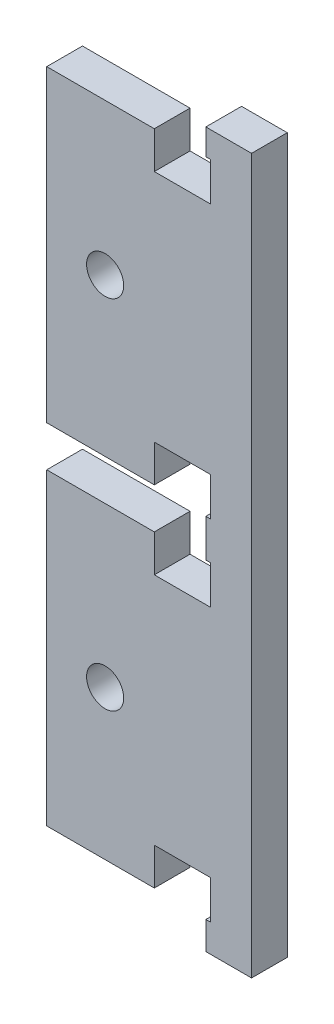
ISO-10303-21;
HEADER;
FILE_DESCRIPTION(('STEP AP214'),'2;1');
FILE_NAME('part.step','',(''),(''),'','','');
FILE_SCHEMA(('AUTOMOTIVE_DESIGN { 1 0 10303 214 1 1 1 1 }'));
ENDSEC;
DATA;
#1=APPLICATION_CONTEXT('core data for automotive mechanical design processes');
#2=APPLICATION_PROTOCOL_DEFINITION('international standard','automotive_design',2000,#1);
#3=PRODUCT_CONTEXT('',#1,'mechanical');
#4=PRODUCT('Part','Part','',(#3));
#5=PRODUCT_RELATED_PRODUCT_CATEGORY('part','',(#4));
#6=PRODUCT_DEFINITION_FORMATION('','',#4);
#7=PRODUCT_DEFINITION_CONTEXT('part definition',#1,'design');
#8=PRODUCT_DEFINITION('design','',#6,#7);
#9=PRODUCT_DEFINITION_SHAPE('','',#8);
#10=(LENGTH_UNIT() NAMED_UNIT(*) SI_UNIT(.MILLI.,.METRE.));
#11=(NAMED_UNIT(*) PLANE_ANGLE_UNIT() SI_UNIT($,.RADIAN.));
#12=(NAMED_UNIT(*) SI_UNIT($,.STERADIAN.) SOLID_ANGLE_UNIT());
#13=UNCERTAINTY_MEASURE_WITH_UNIT(LENGTH_MEASURE(1.E-05),#10,'distance_accuracy_value','');
#14=(GEOMETRIC_REPRESENTATION_CONTEXT(3) GLOBAL_UNCERTAINTY_ASSIGNED_CONTEXT((#13)) GLOBAL_UNIT_ASSIGNED_CONTEXT((#10,
#11,#12)) REPRESENTATION_CONTEXT('',''));
#15=CARTESIAN_POINT('',(0.,0.,0.));
#16=DIRECTION('',(0.,0.,1.));
#17=DIRECTION('',(1.,0.,0.));
#18=AXIS2_PLACEMENT_3D('',#15,#16,#17);
#19=CARTESIAN_POINT('',(0.,0.,6.35));
#20=DIRECTION('',(0.,0.,-1.));
#21=DIRECTION('',(-1.,0.,0.));
#22=AXIS2_PLACEMENT_3D('',#19,#20,#21);
#23=PLANE('',#22);
#24=CARTESIAN_POINT('',(-332.325441570954,231.035658294021,6.35));
#25=DIRECTION('',(0.,0.,1.));
#26=DIRECTION('',(1.,0.,0.));
#27=AXIS2_PLACEMENT_3D('',#24,#25,#26);
#28=CIRCLE('',#27,3.30000000000003);
#29=CARTESIAN_POINT('',(-329.025441570954,231.035658294021,6.35));
#30=VERTEX_POINT('',#29);
#31=EDGE_CURVE('E522',#30,#30,#28,.T.);
#32=ORIENTED_EDGE('',*,*,#31,.F.);
#33=EDGE_LOOP('',(#32));
#34=FACE_BOUND('',#33,.T.);
#35=CARTESIAN_POINT('',(-332.325441570954,167.535658294021,6.35));
#36=DIRECTION('',(0.,0.,1.));
#37=DIRECTION('',(1.,0.,0.));
#38=AXIS2_PLACEMENT_3D('',#35,#36,#37);
#39=CIRCLE('',#38,3.30000000000003);
#40=CARTESIAN_POINT('',(-329.025441570954,167.535658294021,6.35));
#41=VERTEX_POINT('',#40);
#42=EDGE_CURVE('E516',#41,#41,#39,.T.);
#43=ORIENTED_EDGE('',*,*,#42,.F.);
#44=EDGE_LOOP('',(#43));
#45=FACE_BOUND('',#44,.T.);
#46=DIRECTION('',(0.,1.,0.));
#47=VECTOR('',#46,1.);
#48=CARTESIAN_POINT('',(-306.290441570954,135.785658294024,6.35));
#49=LINE('',#48,#47);
#50=CARTESIAN_POINT('',(-306.290441570954,135.785658294024,6.35));
#51=VERTEX_POINT('',#50);
#52=CARTESIAN_POINT('',(-306.290441570954,262.785658294021,6.35));
#53=VERTEX_POINT('',#52);
#54=EDGE_CURVE('E506',#51,#53,#49,.T.);
#55=ORIENTED_EDGE('',*,*,#54,.T.);
#56=DIRECTION('',(-1.,0.,0.));
#57=VECTOR('',#56,1.);
#58=CARTESIAN_POINT('',(0.,262.785658294021,6.35));
#59=LINE('',#58,#57);
#60=CARTESIAN_POINT('',(-314.418441570953,262.785658294021,6.35));
#61=VERTEX_POINT('',#60);
#62=EDGE_CURVE('E482',#53,#61,#59,.T.);
#63=ORIENTED_EDGE('',*,*,#62,.T.);
#64=DIRECTION('',(0.,1.,0.));
#65=VECTOR('',#64,1.);
#66=CARTESIAN_POINT('',(-314.418441570953,0.,6.35));
#67=LINE('',#66,#65);
#68=CARTESIAN_POINT('',(-314.418441570953,258.188258294025,6.35));
#69=VERTEX_POINT('',#68);
#70=EDGE_CURVE('E537',#69,#61,#67,.T.);
#71=ORIENTED_EDGE('',*,*,#70,.F.);
#72=DIRECTION('',(-1.,0.,0.));
#73=VECTOR('',#72,1.);
#74=CARTESIAN_POINT('',(0.,258.188258294025,6.35));
#75=LINE('',#74,#73);
#76=CARTESIAN_POINT('',(-313.54847180827,258.188258294025,6.35));
#77=VERTEX_POINT('',#76);
#78=EDGE_CURVE('E596',#77,#69,#75,.T.);
#79=ORIENTED_EDGE('',*,*,#78,.F.);
#80=DIRECTION('',(0.,1.,0.));
#81=VECTOR('',#80,1.);
#82=CARTESIAN_POINT('',(-313.54847180827,0.,6.35));
#83=LINE('',#82,#81);
#84=CARTESIAN_POINT('',(-313.54847180827,251.330258294025,6.35));
#85=VERTEX_POINT('',#84);
#86=EDGE_CURVE('E598',#85,#77,#83,.T.);
#87=ORIENTED_EDGE('',*,*,#86,.F.);
#88=DIRECTION('',(1.,0.,0.));
#89=VECTOR('',#88,1.);
#90=CARTESIAN_POINT('',(0.,251.330258294025,6.35));
#91=LINE('',#90,#89);
#92=CARTESIAN_POINT('',(-323.58147180827,251.330258294025,6.35));
#93=VERTEX_POINT('',#92);
#94=EDGE_CURVE('E601',#93,#85,#91,.T.);
#95=ORIENTED_EDGE('',*,*,#94,.F.);
#96=DIRECTION('',(0.,1.,0.));
#97=VECTOR('',#96,1.);
#98=CARTESIAN_POINT('',(-323.58147180827,0.,6.35));
#99=LINE('',#98,#97);
#100=CARTESIAN_POINT('',(-323.58147180827,257.927658294024,6.35));
#101=VERTEX_POINT('',#100);
#102=EDGE_CURVE('E604',#93,#101,#99,.T.);
#103=ORIENTED_EDGE('',*,*,#102,.T.);
#104=DIRECTION('',(1.,0.,0.));
#105=VECTOR('',#104,1.);
#106=CARTESIAN_POINT('',(0.,257.927658294024,6.35));
#107=LINE('',#106,#105);
#108=CARTESIAN_POINT('',(-342.708441632954,257.927658294024,6.35));
#109=VERTEX_POINT('',#108);
#110=EDGE_CURVE('E541',#109,#101,#107,.T.);
#111=ORIENTED_EDGE('',*,*,#110,.F.);
#112=DIRECTION('',(0.,-1.,0.));
#113=VECTOR('',#112,1.);
#114=CARTESIAN_POINT('',(-342.708441632954,1.09887595543316E-12,6.35));
#115=LINE('',#114,#113);
#116=CARTESIAN_POINT('',(-342.708441632954,203.079658294025,6.35));
#117=VERTEX_POINT('',#116);
#118=EDGE_CURVE('E544',#109,#117,#115,.T.);
#119=ORIENTED_EDGE('',*,*,#118,.T.);
#120=DIRECTION('',(-1.,0.,0.));
#121=VECTOR('',#120,1.);
#122=CARTESIAN_POINT('',(0.,203.079658294025,6.35));
#123=LINE('',#122,#121);
#124=CARTESIAN_POINT('',(-323.58147180827,203.079658294025,6.35));
#125=VERTEX_POINT('',#124);
#126=EDGE_CURVE('E547',#125,#117,#123,.T.);
#127=ORIENTED_EDGE('',*,*,#126,.F.);
#128=DIRECTION('',(0.,1.,0.));
#129=VECTOR('',#128,1.);
#130=CARTESIAN_POINT('',(-323.58147180827,0.,6.35));
#131=LINE('',#130,#129);
#132=CARTESIAN_POINT('',(-323.58147180827,209.674258294025,6.35));
#133=VERTEX_POINT('',#132);
#134=EDGE_CURVE('E628',#125,#133,#131,.T.);
#135=ORIENTED_EDGE('',*,*,#134,.T.);
#136=DIRECTION('',(-1.,0.,0.));
#137=VECTOR('',#136,1.);
#138=CARTESIAN_POINT('',(0.,209.674258294025,6.35));
#139=LINE('',#138,#137);
#140=CARTESIAN_POINT('',(-313.54847180827,209.674258294025,6.35));
#141=VERTEX_POINT('',#140);
#142=EDGE_CURVE('E632',#141,#133,#139,.T.);
#143=ORIENTED_EDGE('',*,*,#142,.F.);
#144=DIRECTION('',(0.,1.,0.));
#145=VECTOR('',#144,1.);
#146=CARTESIAN_POINT('',(-313.54847180827,0.,6.35));
#147=LINE('',#146,#145);
#148=CARTESIAN_POINT('',(-313.54847180827,202.816258294025,6.35));
#149=VERTEX_POINT('',#148);
#150=EDGE_CURVE('E635',#149,#141,#147,.T.);
#151=ORIENTED_EDGE('',*,*,#150,.F.);
#152=DIRECTION('',(1.,0.,0.));
#153=VECTOR('',#152,1.);
#154=CARTESIAN_POINT('',(0.,202.816258294025,6.35));
#155=LINE('',#154,#153);
#156=CARTESIAN_POINT('',(-314.418441570953,202.816258294025,6.35));
#157=VERTEX_POINT('',#156);
#158=EDGE_CURVE('E595',#157,#149,#155,.T.);
#159=ORIENTED_EDGE('',*,*,#158,.F.);
#160=DIRECTION('',(0.,1.,0.));
#161=VECTOR('',#160,1.);
#162=CARTESIAN_POINT('',(-314.418441570953,0.,6.35));
#163=LINE('',#162,#161);
#164=CARTESIAN_POINT('',(-314.418441570953,196.085258294025,6.35));
#165=VERTEX_POINT('',#164);
#166=EDGE_CURVE('E549',#165,#157,#163,.T.);
#167=ORIENTED_EDGE('',*,*,#166,.F.);
#168=DIRECTION('',(-1.,0.,0.));
#169=VECTOR('',#168,1.);
#170=CARTESIAN_POINT('',(0.,196.085258294025,6.35));
#171=LINE('',#170,#169);
#172=CARTESIAN_POINT('',(-313.54847180827,196.085258294025,6.35));
#173=VERTEX_POINT('',#172);
#174=EDGE_CURVE('E662',#173,#165,#171,.T.);
#175=ORIENTED_EDGE('',*,*,#174,.F.);
#176=DIRECTION('',(0.,1.,0.));
#177=VECTOR('',#176,1.);
#178=CARTESIAN_POINT('',(-313.54847180827,0.,6.35));
#179=LINE('',#178,#177);
#180=CARTESIAN_POINT('',(-313.54847180827,189.227258294025,6.35));
#181=VERTEX_POINT('',#180);
#182=EDGE_CURVE('E665',#181,#173,#179,.T.);
#183=ORIENTED_EDGE('',*,*,#182,.F.);
#184=DIRECTION('',(1.,0.,0.));
#185=VECTOR('',#184,1.);
#186=CARTESIAN_POINT('',(0.,189.227258294025,6.35));
#187=LINE('',#186,#185);
#188=CARTESIAN_POINT('',(-323.58147180827,189.227258294025,6.35));
#189=VERTEX_POINT('',#188);
#190=EDGE_CURVE('E668',#189,#181,#187,.T.);
#191=ORIENTED_EDGE('',*,*,#190,.F.);
#192=DIRECTION('',(0.,1.,0.));
#193=VECTOR('',#192,1.);
#194=CARTESIAN_POINT('',(-323.58147180827,0.,6.35));
#195=LINE('',#194,#193);
#196=CARTESIAN_POINT('',(-323.58147180827,195.840658294024,6.35));
#197=VERTEX_POINT('',#196);
#198=EDGE_CURVE('E627',#189,#197,#195,.T.);
#199=ORIENTED_EDGE('',*,*,#198,.T.);
#200=DIRECTION('',(1.,0.,0.));
#201=VECTOR('',#200,1.);
#202=CARTESIAN_POINT('',(0.,195.840658294024,6.35));
#203=LINE('',#202,#201);
#204=CARTESIAN_POINT('',(-342.708441632954,195.840658294024,6.35));
#205=VERTEX_POINT('',#204);
#206=EDGE_CURVE('E552',#205,#197,#203,.T.);
#207=ORIENTED_EDGE('',*,*,#206,.F.);
#208=DIRECTION('',(0.,-1.,0.));
#209=VECTOR('',#208,1.);
#210=CARTESIAN_POINT('',(-342.708441632954,1.09887595543316E-12,6.35));
#211=LINE('',#210,#209);
#212=CARTESIAN_POINT('',(-342.708441632954,140.992658294025,6.35));
#213=VERTEX_POINT('',#212);
#214=EDGE_CURVE('E555',#205,#213,#211,.T.);
#215=ORIENTED_EDGE('',*,*,#214,.T.);
#216=DIRECTION('',(-1.,0.,0.));
#217=VECTOR('',#216,1.);
#218=CARTESIAN_POINT('',(0.,140.992658294025,6.35));
#219=LINE('',#218,#217);
#220=CARTESIAN_POINT('',(-323.58147180827,140.992658294025,6.35));
#221=VERTEX_POINT('',#220);
#222=EDGE_CURVE('E558',#221,#213,#219,.T.);
#223=ORIENTED_EDGE('',*,*,#222,.F.);
#224=DIRECTION('',(0.,1.,0.));
#225=VECTOR('',#224,1.);
#226=CARTESIAN_POINT('',(-323.58147180827,0.,6.35));
#227=LINE('',#226,#225);
#228=CARTESIAN_POINT('',(-323.58147180827,147.596658294025,6.35));
#229=VERTEX_POINT('',#228);
#230=EDGE_CURVE('E693',#221,#229,#227,.T.);
#231=ORIENTED_EDGE('',*,*,#230,.T.);
#232=DIRECTION('',(-1.,0.,0.));
#233=VECTOR('',#232,1.);
#234=CARTESIAN_POINT('',(0.,147.596658294025,6.35));
#235=LINE('',#234,#233);
#236=CARTESIAN_POINT('',(-313.54847180827,147.596658294025,6.35));
#237=VERTEX_POINT('',#236);
#238=EDGE_CURVE('E697',#237,#229,#235,.T.);
#239=ORIENTED_EDGE('',*,*,#238,.F.);
#240=DIRECTION('',(0.,1.,0.));
#241=VECTOR('',#240,1.);
#242=CARTESIAN_POINT('',(-313.54847180827,0.,6.35));
#243=LINE('',#242,#241);
#244=CARTESIAN_POINT('',(-313.54847180827,140.738658294025,6.35));
#245=VERTEX_POINT('',#244);
#246=EDGE_CURVE('E700',#245,#237,#243,.T.);
#247=ORIENTED_EDGE('',*,*,#246,.F.);
#248=DIRECTION('',(1.,0.,0.));
#249=VECTOR('',#248,1.);
#250=CARTESIAN_POINT('',(0.,140.738658294025,6.35));
#251=LINE('',#250,#249);
#252=CARTESIAN_POINT('',(-314.418441570953,140.738658294025,6.35));
#253=VERTEX_POINT('',#252);
#254=EDGE_CURVE('E661',#253,#245,#251,.T.);
#255=ORIENTED_EDGE('',*,*,#254,.F.);
#256=DIRECTION('',(0.,1.,0.));
#257=VECTOR('',#256,1.);
#258=CARTESIAN_POINT('',(-314.418441570953,0.,6.35));
#259=LINE('',#258,#257);
#260=CARTESIAN_POINT('',(-314.418441570953,135.785658294021,6.35));
#261=VERTEX_POINT('',#260);
#262=EDGE_CURVE('E560',#261,#253,#259,.T.);
#263=ORIENTED_EDGE('',*,*,#262,.F.);
#264=DIRECTION('',(1.,0.,0.));
#265=VECTOR('',#264,1.);
#266=CARTESIAN_POINT('',(-348.200441570954,135.785658294021,6.35));
#267=LINE('',#266,#265);
#268=EDGE_CURVE('E503',#261,#51,#267,.T.);
#269=ORIENTED_EDGE('',*,*,#268,.T.);
#270=EDGE_LOOP('',(#55,#63,#71,#79,#87,#95,#103,#111,#119,#127,#135,#143,#151,#159,#167,#175,
#183,#191,#199,#207,#215,#223,#231,#239,#247,#255,#263,#269));
#271=FACE_BOUND('',#270,.T.);
#272=ADVANCED_FACE('F297',(#34,#45,#271),#23,.F.);
#273=CARTESIAN_POINT('',(0.,0.,0.));
#274=DIRECTION('',(0.,0.,-1.));
#275=DIRECTION('',(-1.,0.,0.));
#276=AXIS2_PLACEMENT_3D('',#273,#274,#275);
#277=PLANE('',#276);
#278=DIRECTION('',(1.,0.,0.));
#279=VECTOR('',#278,1.);
#280=CARTESIAN_POINT('',(0.,262.785658294021,0.));
#281=LINE('',#280,#279);
#282=CARTESIAN_POINT('',(-314.418441570953,262.785658294021,0.));
#283=VERTEX_POINT('',#282);
#284=CARTESIAN_POINT('',(-306.290441570954,262.785658294021,0.));
#285=VERTEX_POINT('',#284);
#286=EDGE_CURVE('E312',#283,#285,#281,.T.);
#287=ORIENTED_EDGE('',*,*,#286,.T.);
#288=DIRECTION('',(0.,1.,0.));
#289=VECTOR('',#288,1.);
#290=CARTESIAN_POINT('',(-306.290441570954,135.785658294024,0.));
#291=LINE('',#290,#289);
#292=CARTESIAN_POINT('',(-306.290441570954,135.785658294024,0.));
#293=VERTEX_POINT('',#292);
#294=EDGE_CURVE('E495',#293,#285,#291,.T.);
#295=ORIENTED_EDGE('',*,*,#294,.F.);
#296=DIRECTION('',(1.,0.,0.));
#297=VECTOR('',#296,1.);
#298=CARTESIAN_POINT('',(-348.200441570954,135.785658294021,0.));
#299=LINE('',#298,#297);
#300=CARTESIAN_POINT('',(-314.418441570953,135.785658294021,0.));
#301=VERTEX_POINT('',#300);
#302=EDGE_CURVE('E504',#301,#293,#299,.T.);
#303=ORIENTED_EDGE('',*,*,#302,.F.);
#304=DIRECTION('',(0.,-1.,0.));
#305=VECTOR('',#304,1.);
#306=CARTESIAN_POINT('',(-314.418441570953,0.,0.));
#307=LINE('',#306,#305);
#308=CARTESIAN_POINT('',(-314.418441570953,140.738658294025,0.));
#309=VERTEX_POINT('',#308);
#310=EDGE_CURVE('E12',#309,#301,#307,.T.);
#311=ORIENTED_EDGE('',*,*,#310,.F.);
#312=DIRECTION('',(1.,0.,0.));
#313=VECTOR('',#312,1.);
#314=CARTESIAN_POINT('',(0.,140.738658294025,0.));
#315=LINE('',#314,#313);
#316=CARTESIAN_POINT('',(-313.54847180827,140.738658294025,0.));
#317=VERTEX_POINT('',#316);
#318=EDGE_CURVE('E696',#309,#317,#315,.T.);
#319=ORIENTED_EDGE('',*,*,#318,.T.);
#320=DIRECTION('',(0.,1.,0.));
#321=VECTOR('',#320,1.);
#322=CARTESIAN_POINT('',(-313.54847180827,0.,0.));
#323=LINE('',#322,#321);
#324=CARTESIAN_POINT('',(-313.54847180827,147.596658294025,0.));
#325=VERTEX_POINT('',#324);
#326=EDGE_CURVE('E709',#317,#325,#323,.T.);
#327=ORIENTED_EDGE('',*,*,#326,.T.);
#328=DIRECTION('',(-1.,0.,0.));
#329=VECTOR('',#328,1.);
#330=CARTESIAN_POINT('',(0.,147.596658294025,0.));
#331=LINE('',#330,#329);
#332=CARTESIAN_POINT('',(-323.58147180827,147.596658294025,0.));
#333=VERTEX_POINT('',#332);
#334=EDGE_CURVE('E706',#325,#333,#331,.T.);
#335=ORIENTED_EDGE('',*,*,#334,.T.);
#336=DIRECTION('',(0.,1.,0.));
#337=VECTOR('',#336,1.);
#338=CARTESIAN_POINT('',(-323.58147180827,0.,0.));
#339=LINE('',#338,#337);
#340=CARTESIAN_POINT('',(-323.58147180827,140.992658294025,0.));
#341=VERTEX_POINT('',#340);
#342=EDGE_CURVE('E685',#341,#333,#339,.T.);
#343=ORIENTED_EDGE('',*,*,#342,.F.);
#344=DIRECTION('',(-1.,0.,0.));
#345=VECTOR('',#344,1.);
#346=CARTESIAN_POINT('',(0.,140.992658294025,0.));
#347=LINE('',#346,#345);
#348=CARTESIAN_POINT('',(-342.708441632954,140.992658294025,0.));
#349=VERTEX_POINT('',#348);
#350=EDGE_CURVE('E540',#341,#349,#347,.T.);
#351=ORIENTED_EDGE('',*,*,#350,.T.);
#352=DIRECTION('',(0.,-1.,0.));
#353=VECTOR('',#352,1.);
#354=CARTESIAN_POINT('',(-342.708441632954,1.09887595543316E-12,0.));
#355=LINE('',#354,#353);
#356=CARTESIAN_POINT('',(-342.708441632954,195.840658294024,0.));
#357=VERTEX_POINT('',#356);
#358=EDGE_CURVE('E579',#357,#349,#355,.T.);
#359=ORIENTED_EDGE('',*,*,#358,.F.);
#360=DIRECTION('',(1.,0.,0.));
#361=VECTOR('',#360,1.);
#362=CARTESIAN_POINT('',(0.,195.840658294024,0.));
#363=LINE('',#362,#361);
#364=CARTESIAN_POINT('',(-323.58147180827,195.840658294024,0.));
#365=VERTEX_POINT('',#364);
#366=EDGE_CURVE('E576',#357,#365,#363,.T.);
#367=ORIENTED_EDGE('',*,*,#366,.T.);
#368=DIRECTION('',(0.,1.,0.));
#369=VECTOR('',#368,1.);
#370=CARTESIAN_POINT('',(-323.58147180827,0.,0.));
#371=LINE('',#370,#369);
#372=CARTESIAN_POINT('',(-323.58147180827,189.227258294025,0.));
#373=VERTEX_POINT('',#372);
#374=EDGE_CURVE('E664',#373,#365,#371,.T.);
#375=ORIENTED_EDGE('',*,*,#374,.F.);
#376=DIRECTION('',(1.,0.,0.));
#377=VECTOR('',#376,1.);
#378=CARTESIAN_POINT('',(0.,189.227258294025,0.));
#379=LINE('',#378,#377);
#380=CARTESIAN_POINT('',(-313.54847180827,189.227258294025,0.));
#381=VERTEX_POINT('',#380);
#382=EDGE_CURVE('E678',#373,#381,#379,.T.);
#383=ORIENTED_EDGE('',*,*,#382,.T.);
#384=DIRECTION('',(0.,1.,0.));
#385=VECTOR('',#384,1.);
#386=CARTESIAN_POINT('',(-313.54847180827,0.,0.));
#387=LINE('',#386,#385);
#388=CARTESIAN_POINT('',(-313.54847180827,196.085258294025,0.));
#389=VERTEX_POINT('',#388);
#390=EDGE_CURVE('E675',#381,#389,#387,.T.);
#391=ORIENTED_EDGE('',*,*,#390,.T.);
#392=DIRECTION('',(-1.,0.,0.));
#393=VECTOR('',#392,1.);
#394=CARTESIAN_POINT('',(0.,196.085258294025,0.));
#395=LINE('',#394,#393);
#396=CARTESIAN_POINT('',(-314.418441570953,196.085258294025,0.));
#397=VERTEX_POINT('',#396);
#398=EDGE_CURVE('E652',#389,#397,#395,.T.);
#399=ORIENTED_EDGE('',*,*,#398,.T.);
#400=DIRECTION('',(0.,1.,0.));
#401=VECTOR('',#400,1.);
#402=CARTESIAN_POINT('',(-314.418441570953,0.,0.));
#403=LINE('',#402,#401);
#404=CARTESIAN_POINT('',(-314.418441570953,202.816258294025,0.));
#405=VERTEX_POINT('',#404);
#406=EDGE_CURVE('E573',#397,#405,#403,.T.);
#407=ORIENTED_EDGE('',*,*,#406,.T.);
#408=DIRECTION('',(1.,0.,0.));
#409=VECTOR('',#408,1.);
#410=CARTESIAN_POINT('',(0.,202.816258294025,0.));
#411=LINE('',#410,#409);
#412=CARTESIAN_POINT('',(-313.54847180827,202.816258294025,0.));
#413=VERTEX_POINT('',#412);
#414=EDGE_CURVE('E631',#405,#413,#411,.T.);
#415=ORIENTED_EDGE('',*,*,#414,.T.);
#416=DIRECTION('',(0.,1.,0.));
#417=VECTOR('',#416,1.);
#418=CARTESIAN_POINT('',(-313.54847180827,0.,0.));
#419=LINE('',#418,#417);
#420=CARTESIAN_POINT('',(-313.54847180827,209.674258294025,0.));
#421=VERTEX_POINT('',#420);
#422=EDGE_CURVE('E644',#413,#421,#419,.T.);
#423=ORIENTED_EDGE('',*,*,#422,.T.);
#424=DIRECTION('',(-1.,0.,0.));
#425=VECTOR('',#424,1.);
#426=CARTESIAN_POINT('',(0.,209.674258294025,0.));
#427=LINE('',#426,#425);
#428=CARTESIAN_POINT('',(-323.58147180827,209.674258294025,0.));
#429=VERTEX_POINT('',#428);
#430=EDGE_CURVE('E641',#421,#429,#427,.T.);
#431=ORIENTED_EDGE('',*,*,#430,.T.);
#432=DIRECTION('',(0.,1.,0.));
#433=VECTOR('',#432,1.);
#434=CARTESIAN_POINT('',(-323.58147180827,0.,0.));
#435=LINE('',#434,#433);
#436=CARTESIAN_POINT('',(-323.58147180827,203.079658294025,0.));
#437=VERTEX_POINT('',#436);
#438=EDGE_CURVE('E618',#437,#429,#435,.T.);
#439=ORIENTED_EDGE('',*,*,#438,.F.);
#440=DIRECTION('',(-1.,0.,0.));
#441=VECTOR('',#440,1.);
#442=CARTESIAN_POINT('',(0.,203.079658294025,0.));
#443=LINE('',#442,#441);
#444=CARTESIAN_POINT('',(-342.708441632954,203.079658294025,0.));
#445=VERTEX_POINT('',#444);
#446=EDGE_CURVE('E571',#437,#445,#443,.T.);
#447=ORIENTED_EDGE('',*,*,#446,.T.);
#448=DIRECTION('',(0.,-1.,0.));
#449=VECTOR('',#448,1.);
#450=CARTESIAN_POINT('',(-342.708441632954,1.09887595543316E-12,0.));
#451=LINE('',#450,#449);
#452=CARTESIAN_POINT('',(-342.708441632954,257.927658294024,0.));
#453=VERTEX_POINT('',#452);
#454=EDGE_CURVE('E568',#453,#445,#451,.T.);
#455=ORIENTED_EDGE('',*,*,#454,.F.);
#456=DIRECTION('',(1.,0.,0.));
#457=VECTOR('',#456,1.);
#458=CARTESIAN_POINT('',(0.,257.927658294024,0.));
#459=LINE('',#458,#457);
#460=CARTESIAN_POINT('',(-323.58147180827,257.927658294024,0.));
#461=VERTEX_POINT('',#460);
#462=EDGE_CURVE('E565',#453,#461,#459,.T.);
#463=ORIENTED_EDGE('',*,*,#462,.T.);
#464=DIRECTION('',(0.,1.,0.));
#465=VECTOR('',#464,1.);
#466=CARTESIAN_POINT('',(-323.58147180827,0.,0.));
#467=LINE('',#466,#465);
#468=CARTESIAN_POINT('',(-323.58147180827,251.330258294025,0.));
#469=VERTEX_POINT('',#468);
#470=EDGE_CURVE('E320',#469,#461,#467,.T.);
#471=ORIENTED_EDGE('',*,*,#470,.F.);
#472=DIRECTION('',(1.,0.,0.));
#473=VECTOR('',#472,1.);
#474=CARTESIAN_POINT('',(0.,251.330258294025,0.));
#475=LINE('',#474,#473);
#476=CARTESIAN_POINT('',(-313.54847180827,251.330258294025,0.));
#477=VERTEX_POINT('',#476);
#478=EDGE_CURVE('E611',#469,#477,#475,.T.);
#479=ORIENTED_EDGE('',*,*,#478,.T.);
#480=DIRECTION('',(0.,1.,0.));
#481=VECTOR('',#480,1.);
#482=CARTESIAN_POINT('',(-313.54847180827,0.,0.));
#483=LINE('',#482,#481);
#484=CARTESIAN_POINT('',(-313.54847180827,258.188258294025,0.));
#485=VERTEX_POINT('',#484);
#486=EDGE_CURVE('E608',#477,#485,#483,.T.);
#487=ORIENTED_EDGE('',*,*,#486,.T.);
#488=DIRECTION('',(-1.,0.,0.));
#489=VECTOR('',#488,1.);
#490=CARTESIAN_POINT('',(0.,258.188258294025,0.));
#491=LINE('',#490,#489);
#492=CARTESIAN_POINT('',(-314.418441570953,258.188258294025,0.));
#493=VERTEX_POINT('',#492);
#494=EDGE_CURVE('E586',#485,#493,#491,.T.);
#495=ORIENTED_EDGE('',*,*,#494,.T.);
#496=DIRECTION('',(0.,1.,0.));
#497=VECTOR('',#496,1.);
#498=CARTESIAN_POINT('',(-314.418441570953,0.,0.));
#499=LINE('',#498,#497);
#500=EDGE_CURVE('E498',#493,#283,#499,.T.);
#501=ORIENTED_EDGE('',*,*,#500,.T.);
#502=EDGE_LOOP('',(#287,#295,#303,#311,#319,#327,#335,#343,#351,#359,#367,#375,#383,#391,#399,
#407,#415,#423,#431,#439,#447,#455,#463,#471,#479,#487,#495,#501));
#503=FACE_BOUND('',#502,.T.);
#504=CARTESIAN_POINT('',(-332.325441570954,231.035658294021,0.));
#505=DIRECTION('',(0.,0.,1.));
#506=DIRECTION('',(1.,0.,0.));
#507=AXIS2_PLACEMENT_3D('',#504,#505,#506);
#508=CIRCLE('',#507,3.30000000000003);
#509=CARTESIAN_POINT('',(-329.025441570954,231.035658294021,0.));
#510=VERTEX_POINT('',#509);
#511=EDGE_CURVE('E519',#510,#510,#508,.T.);
#512=ORIENTED_EDGE('',*,*,#511,.T.);
#513=EDGE_LOOP('',(#512));
#514=FACE_BOUND('',#513,.T.);
#515=CARTESIAN_POINT('',(-332.325441570954,167.535658294021,0.));
#516=DIRECTION('',(0.,0.,1.));
#517=DIRECTION('',(1.,0.,0.));
#518=AXIS2_PLACEMENT_3D('',#515,#516,#517);
#519=CIRCLE('',#518,3.30000000000003);
#520=CARTESIAN_POINT('',(-329.025441570954,167.535658294021,0.));
#521=VERTEX_POINT('',#520);
#522=EDGE_CURVE('E515',#521,#521,#519,.T.);
#523=ORIENTED_EDGE('',*,*,#522,.T.);
#524=EDGE_LOOP('',(#523));
#525=FACE_BOUND('',#524,.T.);
#526=ADVANCED_FACE('F492',(#503,#514,#525),#277,.T.);
#527=CARTESIAN_POINT('',(0.,257.927658294024,0.));
#528=DIRECTION('',(0.,-1.,0.));
#529=DIRECTION('',(0.,0.,-1.));
#530=AXIS2_PLACEMENT_3D('',#527,#528,#529);
#531=PLANE('',#530);
#532=DIRECTION('',(0.,0.,1.));
#533=VECTOR('',#532,1.);
#534=CARTESIAN_POINT('',(-323.58147180827,257.927658294024,0.));
#535=LINE('',#534,#533);
#536=EDGE_CURVE('E593',#461,#101,#535,.T.);
#537=ORIENTED_EDGE('',*,*,#536,.F.);
#538=ORIENTED_EDGE('',*,*,#462,.F.);
#539=DIRECTION('',(0.,0.,1.));
#540=VECTOR('',#539,1.);
#541=CARTESIAN_POINT('',(-342.708441632954,257.927658294024,0.));
#542=LINE('',#541,#540);
#543=EDGE_CURVE('E525',#453,#109,#542,.T.);
#544=ORIENTED_EDGE('',*,*,#543,.T.);
#545=ORIENTED_EDGE('',*,*,#110,.T.);
#546=EDGE_LOOP('',(#537,#538,#544,#545));
#547=FACE_BOUND('',#546,.T.);
#548=ADVANCED_FACE('F735',(#547),#531,.F.);
#549=CARTESIAN_POINT('',(0.,203.079658294025,0.));
#550=DIRECTION('',(0.,1.,0.));
#551=DIRECTION('',(0.,0.,1.));
#552=AXIS2_PLACEMENT_3D('',#549,#550,#551);
#553=PLANE('',#552);
#554=DIRECTION('',(0.,0.,1.));
#555=VECTOR('',#554,1.);
#556=CARTESIAN_POINT('',(-323.58147180827,203.079658294025,0.));
#557=LINE('',#556,#555);
#558=EDGE_CURVE('E624',#437,#125,#557,.T.);
#559=ORIENTED_EDGE('',*,*,#558,.T.);
#560=ORIENTED_EDGE('',*,*,#126,.T.);
#561=DIRECTION('',(0.,0.,1.));
#562=VECTOR('',#561,1.);
#563=CARTESIAN_POINT('',(-342.708441632954,203.079658294025,0.));
#564=LINE('',#563,#562);
#565=EDGE_CURVE('E533',#445,#117,#564,.T.);
#566=ORIENTED_EDGE('',*,*,#565,.F.);
#567=ORIENTED_EDGE('',*,*,#446,.F.);
#568=EDGE_LOOP('',(#559,#560,#566,#567));
#569=FACE_BOUND('',#568,.T.);
#570=ADVANCED_FACE('F744',(#569),#553,.F.);
#571=CARTESIAN_POINT('',(0.,195.840658294024,0.));
#572=DIRECTION('',(0.,-1.,0.));
#573=DIRECTION('',(0.,0.,-1.));
#574=AXIS2_PLACEMENT_3D('',#571,#572,#573);
#575=PLANE('',#574);
#576=DIRECTION('',(0.,0.,1.));
#577=VECTOR('',#576,1.);
#578=CARTESIAN_POINT('',(-323.58147180827,195.840658294024,0.));
#579=LINE('',#578,#577);
#580=EDGE_CURVE('E659',#365,#197,#579,.T.);
#581=ORIENTED_EDGE('',*,*,#580,.F.);
#582=ORIENTED_EDGE('',*,*,#366,.F.);
#583=DIRECTION('',(0.,0.,1.));
#584=VECTOR('',#583,1.);
#585=CARTESIAN_POINT('',(-342.708441632954,195.840658294024,0.));
#586=LINE('',#585,#584);
#587=EDGE_CURVE('E531',#357,#205,#586,.T.);
#588=ORIENTED_EDGE('',*,*,#587,.T.);
#589=ORIENTED_EDGE('',*,*,#206,.T.);
#590=EDGE_LOOP('',(#581,#582,#588,#589));
#591=FACE_BOUND('',#590,.T.);
#592=ADVANCED_FACE('F784',(#591),#575,.F.);
#593=CARTESIAN_POINT('',(0.,140.992658294025,0.));
#594=DIRECTION('',(0.,1.,0.));
#595=DIRECTION('',(0.,0.,1.));
#596=AXIS2_PLACEMENT_3D('',#593,#594,#595);
#597=PLANE('',#596);
#598=DIRECTION('',(0.,0.,1.));
#599=VECTOR('',#598,1.);
#600=CARTESIAN_POINT('',(-323.58147180827,140.992658294025,0.));
#601=LINE('',#600,#599);
#602=EDGE_CURVE('E563',#341,#221,#601,.T.);
#603=ORIENTED_EDGE('',*,*,#602,.T.);
#604=ORIENTED_EDGE('',*,*,#222,.T.);
#605=DIRECTION('',(0.,0.,1.));
#606=VECTOR('',#605,1.);
#607=CARTESIAN_POINT('',(-342.708441632954,140.992658294025,0.));
#608=LINE('',#607,#606);
#609=EDGE_CURVE('E528',#349,#213,#608,.T.);
#610=ORIENTED_EDGE('',*,*,#609,.F.);
#611=ORIENTED_EDGE('',*,*,#350,.F.);
#612=EDGE_LOOP('',(#603,#604,#610,#611));
#613=FACE_BOUND('',#612,.T.);
#614=ADVANCED_FACE('F795',(#613),#597,.F.);
#615=CARTESIAN_POINT('',(-348.200441570954,135.785658294021,6.35));
#616=DIRECTION('',(0.,1.,0.));
#617=DIRECTION('',(-1.,0.,0.));
#618=AXIS2_PLACEMENT_3D('',#615,#616,#617);
#619=PLANE('',#618);
#620=ORIENTED_EDGE('',*,*,#268,.F.);
#621=DIRECTION('',(0.,0.,-1.));
#622=VECTOR('',#621,1.);
#623=CARTESIAN_POINT('',(-314.418441570953,135.785658294024,6.35));
#624=LINE('',#623,#622);
#625=EDGE_CURVE('E508',#261,#301,#624,.T.);
#626=ORIENTED_EDGE('',*,*,#625,.T.);
#627=ORIENTED_EDGE('',*,*,#302,.T.);
#628=DIRECTION('',(0.,0.,-1.));
#629=VECTOR('',#628,1.);
#630=CARTESIAN_POINT('',(-306.290441570954,135.785658294024,6.35));
#631=LINE('',#630,#629);
#632=EDGE_CURVE('E305',#51,#293,#631,.T.);
#633=ORIENTED_EDGE('',*,*,#632,.F.);
#634=EDGE_LOOP('',(#620,#626,#627,#633));
#635=FACE_BOUND('',#634,.T.);
#636=ADVANCED_FACE('F299',(#635),#619,.F.);
#637=CARTESIAN_POINT('',(-306.290441570954,135.785658294024,6.35));
#638=DIRECTION('',(-1.,0.,0.));
#639=DIRECTION('',(0.,0.,1.));
#640=AXIS2_PLACEMENT_3D('',#637,#638,#639);
#641=PLANE('',#640);
#642=ORIENTED_EDGE('',*,*,#294,.T.);
#643=DIRECTION('',(0.,0.,1.));
#644=VECTOR('',#643,1.);
#645=CARTESIAN_POINT('',(-306.290441570954,262.785658294021,0.));
#646=LINE('',#645,#644);
#647=EDGE_CURVE('E479',#285,#53,#646,.T.);
#648=ORIENTED_EDGE('',*,*,#647,.T.);
#649=ORIENTED_EDGE('',*,*,#54,.F.);
#650=ORIENTED_EDGE('',*,*,#632,.T.);
#651=EDGE_LOOP('',(#642,#648,#649,#650));
#652=FACE_BOUND('',#651,.T.);
#653=ADVANCED_FACE('F501',(#652),#641,.F.);
#654=CARTESIAN_POINT('',(-332.325441570954,167.535658294021,0.));
#655=DIRECTION('',(0.,0.,1.));
#656=DIRECTION('',(1.,0.,0.));
#657=AXIS2_PLACEMENT_3D('',#654,#655,#656);
#658=CYLINDRICAL_SURFACE('',#657,3.30000000000003);
#659=ORIENTED_EDGE('',*,*,#522,.F.);
#660=EDGE_LOOP('',(#659));
#661=FACE_BOUND('',#660,.T.);
#662=ORIENTED_EDGE('',*,*,#42,.T.);
#663=EDGE_LOOP('',(#662));
#664=FACE_BOUND('',#663,.T.);
#665=ADVANCED_FACE('F821',(#661,#664),#658,.F.);
#666=CARTESIAN_POINT('',(-314.418441570953,0.,0.));
#667=DIRECTION('',(1.,0.,0.));
#668=DIRECTION('',(0.,0.,-1.));
#669=AXIS2_PLACEMENT_3D('',#666,#667,#668);
#670=PLANE('',#669);
#671=ORIENTED_EDGE('',*,*,#262,.T.);
#672=DIRECTION('',(0.,0.,1.));
#673=VECTOR('',#672,1.);
#674=CARTESIAN_POINT('',(-314.418441570953,140.738658294025,0.));
#675=LINE('',#674,#673);
#676=EDGE_CURVE('E682',#309,#253,#675,.T.);
#677=ORIENTED_EDGE('',*,*,#676,.F.);
#678=ORIENTED_EDGE('',*,*,#310,.T.);
#679=ORIENTED_EDGE('',*,*,#625,.F.);
#680=EDGE_LOOP('',(#671,#677,#678,#679));
#681=FACE_BOUND('',#680,.T.);
#682=ADVANCED_FACE('F813',(#681),#670,.F.);
#683=CARTESIAN_POINT('',(-314.418441570953,0.,0.));
#684=DIRECTION('',(1.,0.,0.));
#685=DIRECTION('',(0.,0.,-1.));
#686=AXIS2_PLACEMENT_3D('',#683,#684,#685);
#687=PLANE('',#686);
#688=ORIENTED_EDGE('',*,*,#70,.T.);
#689=DIRECTION('',(0.,0.,1.));
#690=VECTOR('',#689,1.);
#691=CARTESIAN_POINT('',(-314.418441570953,262.785658294021,0.));
#692=LINE('',#691,#690);
#693=EDGE_CURVE('E487',#283,#61,#692,.T.);
#694=ORIENTED_EDGE('',*,*,#693,.F.);
#695=ORIENTED_EDGE('',*,*,#500,.F.);
#696=DIRECTION('',(0.,0.,1.));
#697=VECTOR('',#696,1.);
#698=CARTESIAN_POINT('',(-314.418441570953,258.188258294025,0.));
#699=LINE('',#698,#697);
#700=EDGE_CURVE('E590',#493,#69,#699,.T.);
#701=ORIENTED_EDGE('',*,*,#700,.T.);
#702=EDGE_LOOP('',(#688,#694,#695,#701));
#703=FACE_BOUND('',#702,.T.);
#704=ADVANCED_FACE('F718',(#703),#687,.F.);
#705=CARTESIAN_POINT('',(-342.708441632954,1.09887595543316E-12,0.));
#706=DIRECTION('',(-1.,0.,0.));
#707=DIRECTION('',(0.,-1.,0.));
#708=AXIS2_PLACEMENT_3D('',#705,#706,#707);
#709=PLANE('',#708);
#710=ORIENTED_EDGE('',*,*,#118,.F.);
#711=ORIENTED_EDGE('',*,*,#543,.F.);
#712=ORIENTED_EDGE('',*,*,#454,.T.);
#713=ORIENTED_EDGE('',*,*,#565,.T.);
#714=EDGE_LOOP('',(#710,#711,#712,#713));
#715=FACE_BOUND('',#714,.T.);
#716=ADVANCED_FACE('F742',(#715),#709,.T.);
#717=CARTESIAN_POINT('',(-314.418441570953,0.,0.));
#718=DIRECTION('',(1.,0.,0.));
#719=DIRECTION('',(0.,0.,-1.));
#720=AXIS2_PLACEMENT_3D('',#717,#718,#719);
#721=PLANE('',#720);
#722=ORIENTED_EDGE('',*,*,#406,.F.);
#723=DIRECTION('',(0.,0.,1.));
#724=VECTOR('',#723,1.);
#725=CARTESIAN_POINT('',(-314.418441570953,196.085258294025,0.));
#726=LINE('',#725,#724);
#727=EDGE_CURVE('E656',#397,#165,#726,.T.);
#728=ORIENTED_EDGE('',*,*,#727,.T.);
#729=ORIENTED_EDGE('',*,*,#166,.T.);
#730=DIRECTION('',(0.,0.,1.));
#731=VECTOR('',#730,1.);
#732=CARTESIAN_POINT('',(-314.418441570953,202.816258294025,0.));
#733=LINE('',#732,#731);
#734=EDGE_CURVE('E615',#405,#157,#733,.T.);
#735=ORIENTED_EDGE('',*,*,#734,.F.);
#736=EDGE_LOOP('',(#722,#728,#729,#735));
#737=FACE_BOUND('',#736,.T.);
#738=ADVANCED_FACE('F764',(#737),#721,.F.);
#739=CARTESIAN_POINT('',(-342.708441632954,1.09887595543316E-12,0.));
#740=DIRECTION('',(-1.,0.,0.));
#741=DIRECTION('',(0.,-1.,0.));
#742=AXIS2_PLACEMENT_3D('',#739,#740,#741);
#743=PLANE('',#742);
#744=ORIENTED_EDGE('',*,*,#214,.F.);
#745=ORIENTED_EDGE('',*,*,#587,.F.);
#746=ORIENTED_EDGE('',*,*,#358,.T.);
#747=ORIENTED_EDGE('',*,*,#609,.T.);
#748=EDGE_LOOP('',(#744,#745,#746,#747));
#749=FACE_BOUND('',#748,.T.);
#750=ADVANCED_FACE('F791',(#749),#743,.T.);
#751=CARTESIAN_POINT('',(-332.325441570954,231.035658294021,0.));
#752=DIRECTION('',(0.,0.,1.));
#753=DIRECTION('',(1.,0.,0.));
#754=AXIS2_PLACEMENT_3D('',#751,#752,#753);
#755=CYLINDRICAL_SURFACE('',#754,3.30000000000003);
#756=ORIENTED_EDGE('',*,*,#511,.F.);
#757=EDGE_LOOP('',(#756));
#758=FACE_BOUND('',#757,.T.);
#759=ORIENTED_EDGE('',*,*,#31,.T.);
#760=EDGE_LOOP('',(#759));
#761=FACE_BOUND('',#760,.T.);
#762=ADVANCED_FACE('F836',(#758,#761),#755,.F.);
#763=CARTESIAN_POINT('',(-323.58147180827,0.,0.));
#764=DIRECTION('',(1.,0.,0.));
#765=DIRECTION('',(0.,0.,-1.));
#766=AXIS2_PLACEMENT_3D('',#763,#764,#765);
#767=PLANE('',#766);
#768=ORIENTED_EDGE('',*,*,#230,.F.);
#769=ORIENTED_EDGE('',*,*,#602,.F.);
#770=ORIENTED_EDGE('',*,*,#342,.T.);
#771=DIRECTION('',(0.,0.,1.));
#772=VECTOR('',#771,1.);
#773=CARTESIAN_POINT('',(-323.58147180827,147.596658294025,0.));
#774=LINE('',#773,#772);
#775=EDGE_CURVE('E689',#333,#229,#774,.T.);
#776=ORIENTED_EDGE('',*,*,#775,.T.);
#777=EDGE_LOOP('',(#768,#769,#770,#776));
#778=FACE_BOUND('',#777,.T.);
#779=ADVANCED_FACE('F797',(#778),#767,.T.);
#780=CARTESIAN_POINT('',(0.,147.596658294025,0.));
#781=DIRECTION('',(0.,1.,0.));
#782=DIRECTION('',(0.,0.,1.));
#783=AXIS2_PLACEMENT_3D('',#780,#781,#782);
#784=PLANE('',#783);
#785=ORIENTED_EDGE('',*,*,#238,.T.);
#786=ORIENTED_EDGE('',*,*,#775,.F.);
#787=ORIENTED_EDGE('',*,*,#334,.F.);
#788=DIRECTION('',(0.,0.,1.));
#789=VECTOR('',#788,1.);
#790=CARTESIAN_POINT('',(-313.54847180827,147.596658294025,0.));
#791=LINE('',#790,#789);
#792=EDGE_CURVE('E687',#325,#237,#791,.T.);
#793=ORIENTED_EDGE('',*,*,#792,.T.);
#794=EDGE_LOOP('',(#785,#786,#787,#793));
#795=FACE_BOUND('',#794,.T.);
#796=ADVANCED_FACE('F802',(#795),#784,.F.);
#797=CARTESIAN_POINT('',(-313.54847180827,0.,0.));
#798=DIRECTION('',(1.,0.,0.));
#799=DIRECTION('',(0.,0.,-1.));
#800=AXIS2_PLACEMENT_3D('',#797,#798,#799);
#801=PLANE('',#800);
#802=ORIENTED_EDGE('',*,*,#246,.T.);
#803=ORIENTED_EDGE('',*,*,#792,.F.);
#804=ORIENTED_EDGE('',*,*,#326,.F.);
#805=DIRECTION('',(0.,0.,1.));
#806=VECTOR('',#805,1.);
#807=CARTESIAN_POINT('',(-313.54847180827,140.738658294025,0.));
#808=LINE('',#807,#806);
#809=EDGE_CURVE('E684',#317,#245,#808,.T.);
#810=ORIENTED_EDGE('',*,*,#809,.T.);
#811=EDGE_LOOP('',(#802,#803,#804,#810));
#812=FACE_BOUND('',#811,.T.);
#813=ADVANCED_FACE('F807',(#812),#801,.F.);
#814=CARTESIAN_POINT('',(0.,140.738658294025,0.));
#815=DIRECTION('',(0.,-1.,0.));
#816=DIRECTION('',(0.,0.,-1.));
#817=AXIS2_PLACEMENT_3D('',#814,#815,#816);
#818=PLANE('',#817);
#819=ORIENTED_EDGE('',*,*,#254,.T.);
#820=ORIENTED_EDGE('',*,*,#809,.F.);
#821=ORIENTED_EDGE('',*,*,#318,.F.);
#822=ORIENTED_EDGE('',*,*,#676,.T.);
#823=EDGE_LOOP('',(#819,#820,#821,#822));
#824=FACE_BOUND('',#823,.T.);
#825=ADVANCED_FACE('F809',(#824),#818,.F.);
#826=CARTESIAN_POINT('',(-323.58147180827,0.,0.));
#827=DIRECTION('',(1.,0.,0.));
#828=DIRECTION('',(0.,0.,-1.));
#829=AXIS2_PLACEMENT_3D('',#826,#827,#828);
#830=PLANE('',#829);
#831=ORIENTED_EDGE('',*,*,#198,.F.);
#832=DIRECTION('',(0.,0.,1.));
#833=VECTOR('',#832,1.);
#834=CARTESIAN_POINT('',(-323.58147180827,189.227258294025,0.));
#835=LINE('',#834,#833);
#836=EDGE_CURVE('E649',#373,#189,#835,.T.);
#837=ORIENTED_EDGE('',*,*,#836,.F.);
#838=ORIENTED_EDGE('',*,*,#374,.T.);
#839=ORIENTED_EDGE('',*,*,#580,.T.);
#840=EDGE_LOOP('',(#831,#837,#838,#839));
#841=FACE_BOUND('',#840,.T.);
#842=ADVANCED_FACE('F780',(#841),#830,.T.);
#843=CARTESIAN_POINT('',(0.,196.085258294025,0.));
#844=DIRECTION('',(0.,1.,0.));
#845=DIRECTION('',(0.,0.,1.));
#846=AXIS2_PLACEMENT_3D('',#843,#844,#845);
#847=PLANE('',#846);
#848=ORIENTED_EDGE('',*,*,#174,.T.);
#849=ORIENTED_EDGE('',*,*,#727,.F.);
#850=ORIENTED_EDGE('',*,*,#398,.F.);
#851=DIRECTION('',(0.,0.,1.));
#852=VECTOR('',#851,1.);
#853=CARTESIAN_POINT('',(-313.54847180827,196.085258294025,0.));
#854=LINE('',#853,#852);
#855=EDGE_CURVE('E654',#389,#173,#854,.T.);
#856=ORIENTED_EDGE('',*,*,#855,.T.);
#857=EDGE_LOOP('',(#848,#849,#850,#856));
#858=FACE_BOUND('',#857,.T.);
#859=ADVANCED_FACE('F767',(#858),#847,.F.);
#860=CARTESIAN_POINT('',(-313.54847180827,0.,0.));
#861=DIRECTION('',(1.,0.,0.));
#862=DIRECTION('',(0.,0.,-1.));
#863=AXIS2_PLACEMENT_3D('',#860,#861,#862);
#864=PLANE('',#863);
#865=ORIENTED_EDGE('',*,*,#182,.T.);
#866=ORIENTED_EDGE('',*,*,#855,.F.);
#867=ORIENTED_EDGE('',*,*,#390,.F.);
#868=DIRECTION('',(0.,0.,1.));
#869=VECTOR('',#868,1.);
#870=CARTESIAN_POINT('',(-313.54847180827,189.227258294025,0.));
#871=LINE('',#870,#869);
#872=EDGE_CURVE('E651',#381,#181,#871,.T.);
#873=ORIENTED_EDGE('',*,*,#872,.T.);
#874=EDGE_LOOP('',(#865,#866,#867,#873));
#875=FACE_BOUND('',#874,.T.);
#876=ADVANCED_FACE('F772',(#875),#864,.F.);
#877=CARTESIAN_POINT('',(0.,189.227258294025,0.));
#878=DIRECTION('',(0.,-1.,0.));
#879=DIRECTION('',(0.,0.,-1.));
#880=AXIS2_PLACEMENT_3D('',#877,#878,#879);
#881=PLANE('',#880);
#882=ORIENTED_EDGE('',*,*,#190,.T.);
#883=ORIENTED_EDGE('',*,*,#872,.F.);
#884=ORIENTED_EDGE('',*,*,#382,.F.);
#885=ORIENTED_EDGE('',*,*,#836,.T.);
#886=EDGE_LOOP('',(#882,#883,#884,#885));
#887=FACE_BOUND('',#886,.T.);
#888=ADVANCED_FACE('F778',(#887),#881,.F.);
#889=CARTESIAN_POINT('',(-323.58147180827,0.,0.));
#890=DIRECTION('',(1.,0.,0.));
#891=DIRECTION('',(0.,0.,-1.));
#892=AXIS2_PLACEMENT_3D('',#889,#890,#891);
#893=PLANE('',#892);
#894=ORIENTED_EDGE('',*,*,#134,.F.);
#895=ORIENTED_EDGE('',*,*,#558,.F.);
#896=ORIENTED_EDGE('',*,*,#438,.T.);
#897=DIRECTION('',(0.,0.,1.));
#898=VECTOR('',#897,1.);
#899=CARTESIAN_POINT('',(-323.58147180827,209.674258294025,0.));
#900=LINE('',#899,#898);
#901=EDGE_CURVE('E622',#429,#133,#900,.T.);
#902=ORIENTED_EDGE('',*,*,#901,.T.);
#903=EDGE_LOOP('',(#894,#895,#896,#902));
#904=FACE_BOUND('',#903,.T.);
#905=ADVANCED_FACE('F749',(#904),#893,.T.);
#906=CARTESIAN_POINT('',(0.,209.674258294025,0.));
#907=DIRECTION('',(0.,1.,0.));
#908=DIRECTION('',(0.,0.,1.));
#909=AXIS2_PLACEMENT_3D('',#906,#907,#908);
#910=PLANE('',#909);
#911=ORIENTED_EDGE('',*,*,#142,.T.);
#912=ORIENTED_EDGE('',*,*,#901,.F.);
#913=ORIENTED_EDGE('',*,*,#430,.F.);
#914=DIRECTION('',(0.,0.,1.));
#915=VECTOR('',#914,1.);
#916=CARTESIAN_POINT('',(-313.54847180827,209.674258294025,0.));
#917=LINE('',#916,#915);
#918=EDGE_CURVE('E620',#421,#141,#917,.T.);
#919=ORIENTED_EDGE('',*,*,#918,.T.);
#920=EDGE_LOOP('',(#911,#912,#913,#919));
#921=FACE_BOUND('',#920,.T.);
#922=ADVANCED_FACE('F753',(#921),#910,.F.);
#923=CARTESIAN_POINT('',(-313.54847180827,0.,0.));
#924=DIRECTION('',(1.,0.,0.));
#925=DIRECTION('',(0.,0.,-1.));
#926=AXIS2_PLACEMENT_3D('',#923,#924,#925);
#927=PLANE('',#926);
#928=ORIENTED_EDGE('',*,*,#150,.T.);
#929=ORIENTED_EDGE('',*,*,#918,.F.);
#930=ORIENTED_EDGE('',*,*,#422,.F.);
#931=DIRECTION('',(0.,0.,1.));
#932=VECTOR('',#931,1.);
#933=CARTESIAN_POINT('',(-313.54847180827,202.816258294025,0.));
#934=LINE('',#933,#932);
#935=EDGE_CURVE('E617',#413,#149,#934,.T.);
#936=ORIENTED_EDGE('',*,*,#935,.T.);
#937=EDGE_LOOP('',(#928,#929,#930,#936));
#938=FACE_BOUND('',#937,.T.);
#939=ADVANCED_FACE('F756',(#938),#927,.F.);
#940=CARTESIAN_POINT('',(0.,202.816258294025,0.));
#941=DIRECTION('',(0.,-1.,0.));
#942=DIRECTION('',(0.,0.,-1.));
#943=AXIS2_PLACEMENT_3D('',#940,#941,#942);
#944=PLANE('',#943);
#945=ORIENTED_EDGE('',*,*,#158,.T.);
#946=ORIENTED_EDGE('',*,*,#935,.F.);
#947=ORIENTED_EDGE('',*,*,#414,.F.);
#948=ORIENTED_EDGE('',*,*,#734,.T.);
#949=EDGE_LOOP('',(#945,#946,#947,#948));
#950=FACE_BOUND('',#949,.T.);
#951=ADVANCED_FACE('F858',(#950),#944,.F.);
#952=CARTESIAN_POINT('',(-323.58147180827,0.,0.));
#953=DIRECTION('',(1.,0.,0.));
#954=DIRECTION('',(0.,0.,-1.));
#955=AXIS2_PLACEMENT_3D('',#952,#953,#954);
#956=PLANE('',#955);
#957=ORIENTED_EDGE('',*,*,#102,.F.);
#958=DIRECTION('',(0.,0.,1.));
#959=VECTOR('',#958,1.);
#960=CARTESIAN_POINT('',(-323.58147180827,251.330258294025,0.));
#961=LINE('',#960,#959);
#962=EDGE_CURVE('E583',#469,#93,#961,.T.);
#963=ORIENTED_EDGE('',*,*,#962,.F.);
#964=ORIENTED_EDGE('',*,*,#470,.T.);
#965=ORIENTED_EDGE('',*,*,#536,.T.);
#966=EDGE_LOOP('',(#957,#963,#964,#965));
#967=FACE_BOUND('',#966,.T.);
#968=ADVANCED_FACE('F732',(#967),#956,.T.);
#969=CARTESIAN_POINT('',(0.,258.188258294025,0.));
#970=DIRECTION('',(0.,1.,0.));
#971=DIRECTION('',(0.,0.,1.));
#972=AXIS2_PLACEMENT_3D('',#969,#970,#971);
#973=PLANE('',#972);
#974=ORIENTED_EDGE('',*,*,#78,.T.);
#975=ORIENTED_EDGE('',*,*,#700,.F.);
#976=ORIENTED_EDGE('',*,*,#494,.F.);
#977=DIRECTION('',(0.,0.,1.));
#978=VECTOR('',#977,1.);
#979=CARTESIAN_POINT('',(-313.54847180827,258.188258294025,0.));
#980=LINE('',#979,#978);
#981=EDGE_CURVE('E588',#485,#77,#980,.T.);
#982=ORIENTED_EDGE('',*,*,#981,.T.);
#983=EDGE_LOOP('',(#974,#975,#976,#982));
#984=FACE_BOUND('',#983,.T.);
#985=ADVANCED_FACE('F721',(#984),#973,.F.);
#986=CARTESIAN_POINT('',(-313.54847180827,0.,0.));
#987=DIRECTION('',(1.,0.,0.));
#988=DIRECTION('',(0.,0.,-1.));
#989=AXIS2_PLACEMENT_3D('',#986,#987,#988);
#990=PLANE('',#989);
#991=ORIENTED_EDGE('',*,*,#86,.T.);
#992=ORIENTED_EDGE('',*,*,#981,.F.);
#993=ORIENTED_EDGE('',*,*,#486,.F.);
#994=DIRECTION('',(0.,0.,1.));
#995=VECTOR('',#994,1.);
#996=CARTESIAN_POINT('',(-313.54847180827,251.330258294025,0.));
#997=LINE('',#996,#995);
#998=EDGE_CURVE('E585',#477,#85,#997,.T.);
#999=ORIENTED_EDGE('',*,*,#998,.T.);
#1000=EDGE_LOOP('',(#991,#992,#993,#999));
#1001=FACE_BOUND('',#1000,.T.);
#1002=ADVANCED_FACE('F725',(#1001),#990,.F.);
#1003=CARTESIAN_POINT('',(0.,251.330258294025,0.));
#1004=DIRECTION('',(0.,-1.,0.));
#1005=DIRECTION('',(0.,0.,-1.));
#1006=AXIS2_PLACEMENT_3D('',#1003,#1004,#1005);
#1007=PLANE('',#1006);
#1008=ORIENTED_EDGE('',*,*,#94,.T.);
#1009=ORIENTED_EDGE('',*,*,#998,.F.);
#1010=ORIENTED_EDGE('',*,*,#478,.F.);
#1011=ORIENTED_EDGE('',*,*,#962,.T.);
#1012=EDGE_LOOP('',(#1008,#1009,#1010,#1011));
#1013=FACE_BOUND('',#1012,.T.);
#1014=ADVANCED_FACE('F731',(#1013),#1007,.F.);
#1015=CARTESIAN_POINT('',(0.,262.785658294021,0.));
#1016=DIRECTION('',(0.,-1.,0.));
#1017=DIRECTION('',(0.,0.,-1.));
#1018=AXIS2_PLACEMENT_3D('',#1015,#1016,#1017);
#1019=PLANE('',#1018);
#1020=ORIENTED_EDGE('',*,*,#647,.F.);
#1021=ORIENTED_EDGE('',*,*,#286,.F.);
#1022=ORIENTED_EDGE('',*,*,#693,.T.);
#1023=ORIENTED_EDGE('',*,*,#62,.F.);
#1024=EDGE_LOOP('',(#1020,#1021,#1022,#1023));
#1025=FACE_BOUND('',#1024,.T.);
#1026=ADVANCED_FACE('F480',(#1025),#1019,.F.);
#1027=CLOSED_SHELL('',(#272,#526,#548,#570,#592,#614,#636,#653,#665,#682,#704,#716,#738,#750,
#762,#779,#796,#813,#825,#842,#859,#876,#888,#905,#922,#939,#951,#968,#985,#1002,#1014,#1026));
#1028=MANIFOLD_SOLID_BREP('B2',#1027);
#1029=ADVANCED_BREP_SHAPE_REPRESENTATION('',(#18,#1028),#14);
#1030=SHAPE_DEFINITION_REPRESENTATION(#9,#1029);
ENDSEC;
END-ISO-10303-21;
